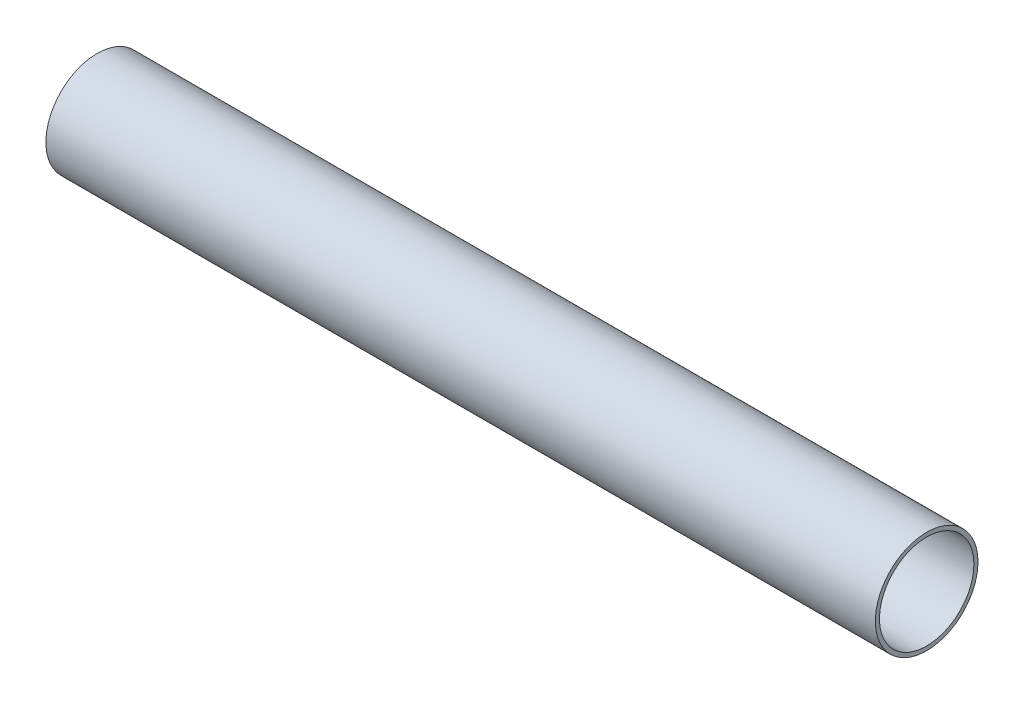
ISO-10303-21;
HEADER;
FILE_DESCRIPTION(('STEP AP214'),'2;1');
FILE_NAME('part.step','',(''),(''),'','','');
FILE_SCHEMA(('AUTOMOTIVE_DESIGN { 1 0 10303 214 1 1 1 1 }'));
ENDSEC;
DATA;
#1=APPLICATION_CONTEXT('core data for automotive mechanical design processes');
#2=APPLICATION_PROTOCOL_DEFINITION('international standard','automotive_design',2000,#1);
#3=PRODUCT_CONTEXT('',#1,'mechanical');
#4=PRODUCT('Part','Part','',(#3));
#5=PRODUCT_RELATED_PRODUCT_CATEGORY('part','',(#4));
#6=PRODUCT_DEFINITION_FORMATION('','',#4);
#7=PRODUCT_DEFINITION_CONTEXT('part definition',#1,'design');
#8=PRODUCT_DEFINITION('design','',#6,#7);
#9=PRODUCT_DEFINITION_SHAPE('','',#8);
#10=(LENGTH_UNIT() NAMED_UNIT(*) SI_UNIT(.MILLI.,.METRE.));
#11=(NAMED_UNIT(*) PLANE_ANGLE_UNIT() SI_UNIT($,.RADIAN.));
#12=(NAMED_UNIT(*) SI_UNIT($,.STERADIAN.) SOLID_ANGLE_UNIT());
#13=UNCERTAINTY_MEASURE_WITH_UNIT(LENGTH_MEASURE(1.E-05),#10,'distance_accuracy_value','');
#14=(GEOMETRIC_REPRESENTATION_CONTEXT(3) GLOBAL_UNCERTAINTY_ASSIGNED_CONTEXT((#13)) GLOBAL_UNIT_ASSIGNED_CONTEXT((#10,
#11,#12)) REPRESENTATION_CONTEXT('',''));
#15=CARTESIAN_POINT('',(0.,0.,0.));
#16=DIRECTION('',(0.,0.,1.));
#17=DIRECTION('',(1.,0.,0.));
#18=AXIS2_PLACEMENT_3D('',#15,#16,#17);
#19=CARTESIAN_POINT('',(227.,667.332012286218,-386.357743681072));
#20=DIRECTION('',(1.,0.,0.));
#21=DIRECTION('',(0.,0.,-1.));
#22=AXIS2_PLACEMENT_3D('',#19,#20,#21);
#23=CYLINDRICAL_SURFACE('',#22,11.5);
#24=CARTESIAN_POINT('',(76.9999999999995,667.332012286218,-386.357743681072));
#25=DIRECTION('',(1.,0.,0.));
#26=DIRECTION('',(0.,0.,-1.));
#27=AXIS2_PLACEMENT_3D('',#24,#25,#26);
#28=CIRCLE('',#27,11.5);
#29=CARTESIAN_POINT('',(76.9999999999995,667.332012286218,-397.857743681072));
#30=VERTEX_POINT('',#29);
#31=EDGE_CURVE('E27',#30,#30,#28,.T.);
#32=ORIENTED_EDGE('',*,*,#31,.F.);
#33=EDGE_LOOP('',(#32));
#34=FACE_BOUND('',#33,.T.);
#35=CARTESIAN_POINT('',(279.,667.332012286218,-386.357743681072));
#36=DIRECTION('',(1.,0.,0.));
#37=DIRECTION('',(0.,0.,-1.));
#38=AXIS2_PLACEMENT_3D('',#35,#36,#37);
#39=CIRCLE('',#38,11.5);
#40=CARTESIAN_POINT('',(279.,667.332012286218,-397.857743681072));
#41=VERTEX_POINT('',#40);
#42=EDGE_CURVE('E18',#41,#41,#39,.F.);
#43=ORIENTED_EDGE('',*,*,#42,.F.);
#44=EDGE_LOOP('',(#43));
#45=FACE_BOUND('',#44,.T.);
#46=ADVANCED_FACE('F15',(#34,#45),#23,.F.);
#47=CARTESIAN_POINT('',(279.,667.332012286218,-386.357743681072));
#48=DIRECTION('',(1.,0.,0.));
#49=DIRECTION('',(0.,0.,-1.));
#50=AXIS2_PLACEMENT_3D('',#47,#48,#49);
#51=PLANE('',#50);
#52=ORIENTED_EDGE('',*,*,#42,.T.);
#53=EDGE_LOOP('',(#52));
#54=FACE_BOUND('',#53,.T.);
#55=CARTESIAN_POINT('',(279.,667.332012286218,-386.357743681072));
#56=DIRECTION('',(1.,0.,0.));
#57=DIRECTION('',(0.,0.,-1.));
#58=AXIS2_PLACEMENT_3D('',#55,#56,#57);
#59=CIRCLE('',#58,12.5);
#60=CARTESIAN_POINT('',(279.,667.332012286218,-398.857743681072));
#61=VERTEX_POINT('',#60);
#62=EDGE_CURVE('E22',#61,#61,#59,.F.);
#63=ORIENTED_EDGE('',*,*,#62,.F.);
#64=EDGE_LOOP('',(#63));
#65=FACE_BOUND('',#64,.T.);
#66=ADVANCED_FACE('F35',(#54,#65),#51,.T.);
#67=CARTESIAN_POINT('',(76.9999999999995,667.332012286218,-386.357743681072));
#68=DIRECTION('',(-1.,0.,0.));
#69=DIRECTION('',(0.,0.,1.));
#70=AXIS2_PLACEMENT_3D('',#67,#68,#69);
#71=PLANE('',#70);
#72=ORIENTED_EDGE('',*,*,#31,.T.);
#73=EDGE_LOOP('',(#72));
#74=FACE_BOUND('',#73,.T.);
#75=CARTESIAN_POINT('',(76.9999999999995,667.332012286218,-386.357743681072));
#76=DIRECTION('',(1.,0.,0.));
#77=DIRECTION('',(0.,0.,-1.));
#78=AXIS2_PLACEMENT_3D('',#75,#76,#77);
#79=CIRCLE('',#78,12.5);
#80=CARTESIAN_POINT('',(76.9999999999995,667.332012286218,-398.857743681072));
#81=VERTEX_POINT('',#80);
#82=EDGE_CURVE('E10',#81,#81,#79,.T.);
#83=ORIENTED_EDGE('',*,*,#82,.F.);
#84=EDGE_LOOP('',(#83));
#85=FACE_BOUND('',#84,.T.);
#86=ADVANCED_FACE('F44',(#74,#85),#71,.T.);
#87=CARTESIAN_POINT('',(227.,667.332012286218,-386.357743681072));
#88=DIRECTION('',(1.,0.,0.));
#89=DIRECTION('',(0.,0.,-1.));
#90=AXIS2_PLACEMENT_3D('',#87,#88,#89);
#91=CYLINDRICAL_SURFACE('',#90,12.5);
#92=ORIENTED_EDGE('',*,*,#62,.T.);
#93=EDGE_LOOP('',(#92));
#94=FACE_BOUND('',#93,.T.);
#95=ORIENTED_EDGE('',*,*,#82,.T.);
#96=EDGE_LOOP('',(#95));
#97=FACE_BOUND('',#96,.T.);
#98=ADVANCED_FACE('F45',(#94,#97),#91,.T.);
#99=CLOSED_SHELL('',(#46,#66,#86,#98));
#100=MANIFOLD_SOLID_BREP('B1',#99);
#101=ADVANCED_BREP_SHAPE_REPRESENTATION('',(#18,#100),#14);
#102=SHAPE_DEFINITION_REPRESENTATION(#9,#101);
ENDSEC;
END-ISO-10303-21;
